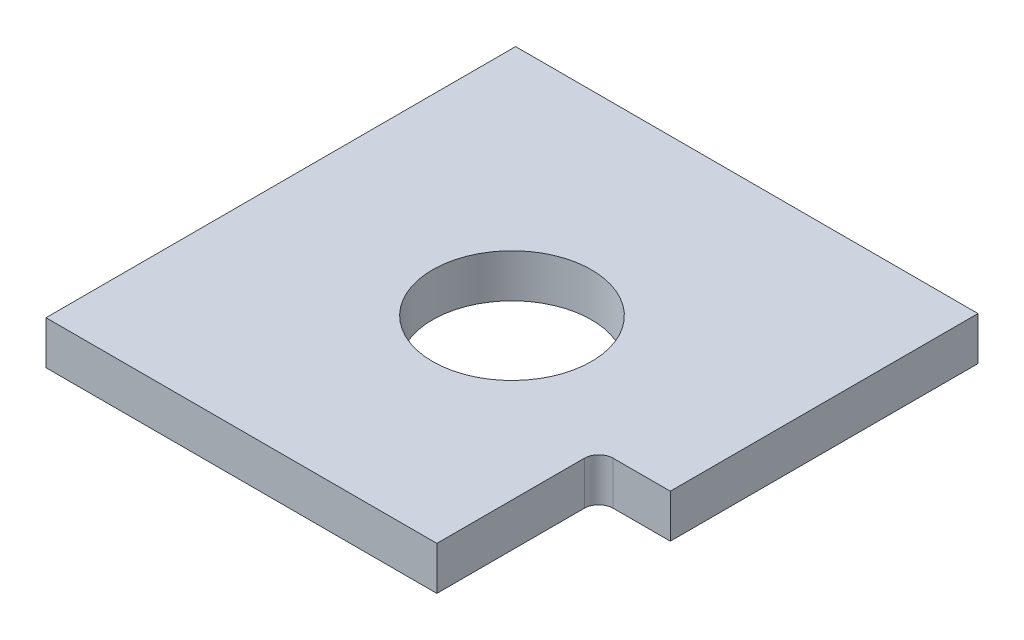
ISO-10303-21;
HEADER;
FILE_DESCRIPTION(('STEP AP214'),'2;1');
FILE_NAME('part.step','',(''),(''),'','','');
FILE_SCHEMA(('AUTOMOTIVE_DESIGN { 1 0 10303 214 1 1 1 1 }'));
ENDSEC;
DATA;
#1=APPLICATION_CONTEXT('core data for automotive mechanical design processes');
#2=APPLICATION_PROTOCOL_DEFINITION('international standard','automotive_design',2000,#1);
#3=PRODUCT_CONTEXT('',#1,'mechanical');
#4=PRODUCT('Part','Part','',(#3));
#5=PRODUCT_RELATED_PRODUCT_CATEGORY('part','',(#4));
#6=PRODUCT_DEFINITION_FORMATION('','',#4);
#7=PRODUCT_DEFINITION_CONTEXT('part definition',#1,'design');
#8=PRODUCT_DEFINITION('design','',#6,#7);
#9=PRODUCT_DEFINITION_SHAPE('','',#8);
#10=(LENGTH_UNIT() NAMED_UNIT(*) SI_UNIT(.MILLI.,.METRE.));
#11=(NAMED_UNIT(*) PLANE_ANGLE_UNIT() SI_UNIT($,.RADIAN.));
#12=(NAMED_UNIT(*) SI_UNIT($,.STERADIAN.) SOLID_ANGLE_UNIT());
#13=UNCERTAINTY_MEASURE_WITH_UNIT(LENGTH_MEASURE(1.E-05),#10,'distance_accuracy_value','');
#14=(GEOMETRIC_REPRESENTATION_CONTEXT(3) GLOBAL_UNCERTAINTY_ASSIGNED_CONTEXT((#13)) GLOBAL_UNIT_ASSIGNED_CONTEXT((#10,
#11,#12)) REPRESENTATION_CONTEXT('',''));
#15=CARTESIAN_POINT('',(0.,0.,0.));
#16=DIRECTION('',(0.,0.,1.));
#17=DIRECTION('',(1.,0.,0.));
#18=AXIS2_PLACEMENT_3D('',#15,#16,#17);
#19=CARTESIAN_POINT('',(24.1000001252952,6.,12.0890702603596));
#20=DIRECTION('',(0.,1.,0.));
#21=DIRECTION('',(0.,0.,1.));
#22=AXIS2_PLACEMENT_3D('',#19,#20,#21);
#23=PLANE('',#22);
#24=DIRECTION('',(0.,0.,-1.));
#25=VECTOR('',#24,1.);
#26=CARTESIAN_POINT('',(22.1000001252951,6.,32.5000000000002));
#27=LINE('',#26,#25);
#28=CARTESIAN_POINT('',(22.1000001252951,6.,32.5000000000002));
#29=VERTEX_POINT('',#28);
#30=CARTESIAN_POINT('',(22.1000001252951,6.,12.0890702603522));
#31=VERTEX_POINT('',#30);
#32=EDGE_CURVE('E145',#29,#31,#27,.T.);
#33=ORIENTED_EDGE('',*,*,#32,.T.);
#34=CARTESIAN_POINT('',(24.1000001252952,6.,12.0890702603596));
#35=DIRECTION('',(0.,-1.,0.));
#36=DIRECTION('',(0.,0.,1.));
#37=AXIS2_PLACEMENT_3D('',#34,#35,#36);
#38=CIRCLE('',#37,2.00000000000013);
#39=CARTESIAN_POINT('',(24.0999996486235,6.,10.0890702603595));
#40=VERTEX_POINT('',#39);
#41=EDGE_CURVE('E98',#31,#40,#38,.T.);
#42=ORIENTED_EDGE('',*,*,#41,.T.);
#43=DIRECTION('',(1.,0.,0.));
#44=VECTOR('',#43,1.);
#45=CARTESIAN_POINT('',(24.0999996486235,6.,10.0890702603595));
#46=LINE('',#45,#44);
#47=CARTESIAN_POINT('',(32.0000001254616,6.,10.0890702603595));
#48=VERTEX_POINT('',#47);
#49=EDGE_CURVE('E157',#40,#48,#46,.T.);
#50=ORIENTED_EDGE('',*,*,#49,.T.);
#51=DIRECTION('',(0.,0.,-1.));
#52=VECTOR('',#51,1.);
#53=CARTESIAN_POINT('',(32.0000001254616,6.,-32.5000000000002));
#54=LINE('',#53,#52);
#55=CARTESIAN_POINT('',(32.0000001254616,6.,-32.5000000000002));
#56=VERTEX_POINT('',#55);
#57=EDGE_CURVE('E114',#48,#56,#54,.T.);
#58=ORIENTED_EDGE('',*,*,#57,.T.);
#59=DIRECTION('',(-1.,0.,0.));
#60=VECTOR('',#59,1.);
#61=CARTESIAN_POINT('',(-31.999999874703,6.,-32.5000000000002));
#62=LINE('',#61,#60);
#63=CARTESIAN_POINT('',(-31.999999874703,6.,-32.5000000000002));
#64=VERTEX_POINT('',#63);
#65=EDGE_CURVE('E108',#56,#64,#62,.T.);
#66=ORIENTED_EDGE('',*,*,#65,.T.);
#67=DIRECTION('',(0.,0.,1.));
#68=VECTOR('',#67,1.);
#69=CARTESIAN_POINT('',(-31.999999874703,6.,32.5000000000002));
#70=LINE('',#69,#68);
#71=CARTESIAN_POINT('',(-31.999999874703,6.,32.5000000000002));
#72=VERTEX_POINT('',#71);
#73=EDGE_CURVE('E112',#64,#72,#70,.T.);
#74=ORIENTED_EDGE('',*,*,#73,.T.);
#75=DIRECTION('',(1.,0.,0.));
#76=VECTOR('',#75,1.);
#77=CARTESIAN_POINT('',(22.1000001252951,6.,32.5000000000002));
#78=LINE('',#77,#76);
#79=EDGE_CURVE('E58',#72,#29,#78,.T.);
#80=ORIENTED_EDGE('',*,*,#79,.T.);
#81=EDGE_LOOP('',(#33,#42,#50,#58,#66,#74,#80));
#82=FACE_BOUND('',#81,.T.);
#83=CARTESIAN_POINT('',(0.,6.,0.));
#84=DIRECTION('',(0.,1.,0.));
#85=DIRECTION('',(0.,0.,1.));
#86=AXIS2_PLACEMENT_3D('',#83,#84,#85);
#87=CIRCLE('',#86,11.);
#88=CARTESIAN_POINT('',(0.,6.,11.));
#89=VERTEX_POINT('',#88);
#90=EDGE_CURVE('E136',#89,#89,#87,.T.);
#91=ORIENTED_EDGE('',*,*,#90,.F.);
#92=EDGE_LOOP('',(#91));
#93=FACE_BOUND('',#92,.T.);
#94=ADVANCED_FACE('F41',(#82,#93),#23,.T.);
#95=CARTESIAN_POINT('',(24.1000001252952,0.,12.0890702603596));
#96=DIRECTION('',(0.,1.,0.));
#97=DIRECTION('',(0.,0.,1.));
#98=AXIS2_PLACEMENT_3D('',#95,#96,#97);
#99=PLANE('',#98);
#100=DIRECTION('',(0.,0.,-1.));
#101=VECTOR('',#100,1.);
#102=CARTESIAN_POINT('',(22.1000001252951,0.,32.5000000000002));
#103=LINE('',#102,#101);
#104=CARTESIAN_POINT('',(22.1000001252951,0.,32.5000000000002));
#105=VERTEX_POINT('',#104);
#106=CARTESIAN_POINT('',(22.1000001252951,0.,12.0890702603522));
#107=VERTEX_POINT('',#106);
#108=EDGE_CURVE('E132',#105,#107,#103,.T.);
#109=ORIENTED_EDGE('',*,*,#108,.F.);
#110=DIRECTION('',(1.,0.,0.));
#111=VECTOR('',#110,1.);
#112=CARTESIAN_POINT('',(22.1000001252951,0.,32.5000000000002));
#113=LINE('',#112,#111);
#114=CARTESIAN_POINT('',(-31.999999874703,0.,32.5000000000002));
#115=VERTEX_POINT('',#114);
#116=EDGE_CURVE('E90',#115,#105,#113,.T.);
#117=ORIENTED_EDGE('',*,*,#116,.F.);
#118=DIRECTION('',(0.,0.,1.));
#119=VECTOR('',#118,1.);
#120=CARTESIAN_POINT('',(-31.999999874703,0.,32.5000000000002));
#121=LINE('',#120,#119);
#122=CARTESIAN_POINT('',(-31.999999874703,0.,-32.5000000000002));
#123=VERTEX_POINT('',#122);
#124=EDGE_CURVE('E84',#123,#115,#121,.T.);
#125=ORIENTED_EDGE('',*,*,#124,.F.);
#126=DIRECTION('',(-1.,0.,0.));
#127=VECTOR('',#126,1.);
#128=CARTESIAN_POINT('',(-31.999999874703,0.,-32.5000000000002));
#129=LINE('',#128,#127);
#130=CARTESIAN_POINT('',(32.0000001254616,0.,-32.5000000000002));
#131=VERTEX_POINT('',#130);
#132=EDGE_CURVE('E122',#131,#123,#129,.T.);
#133=ORIENTED_EDGE('',*,*,#132,.F.);
#134=DIRECTION('',(0.,0.,-1.));
#135=VECTOR('',#134,1.);
#136=CARTESIAN_POINT('',(32.0000001254616,0.,-32.5000000000002));
#137=LINE('',#136,#135);
#138=CARTESIAN_POINT('',(32.0000001254616,0.,10.0890702603595));
#139=VERTEX_POINT('',#138);
#140=EDGE_CURVE('E140',#139,#131,#137,.T.);
#141=ORIENTED_EDGE('',*,*,#140,.F.);
#142=DIRECTION('',(1.,0.,0.));
#143=VECTOR('',#142,1.);
#144=CARTESIAN_POINT('',(24.0999996486235,0.,10.0890702603595));
#145=LINE('',#144,#143);
#146=CARTESIAN_POINT('',(24.0999996486235,0.,10.0890702603595));
#147=VERTEX_POINT('',#146);
#148=EDGE_CURVE('E138',#147,#139,#145,.T.);
#149=ORIENTED_EDGE('',*,*,#148,.F.);
#150=CARTESIAN_POINT('',(24.1000001252952,0.,12.0890702603596));
#151=DIRECTION('',(0.,-1.,0.));
#152=DIRECTION('',(0.,0.,1.));
#153=AXIS2_PLACEMENT_3D('',#150,#151,#152);
#154=CIRCLE('',#153,2.00000000000013);
#155=EDGE_CURVE('E135',#107,#147,#154,.T.);
#156=ORIENTED_EDGE('',*,*,#155,.F.);
#157=EDGE_LOOP('',(#109,#117,#125,#133,#141,#149,#156));
#158=FACE_BOUND('',#157,.T.);
#159=CARTESIAN_POINT('',(0.,0.,0.));
#160=DIRECTION('',(0.,1.,0.));
#161=DIRECTION('',(0.,0.,1.));
#162=AXIS2_PLACEMENT_3D('',#159,#160,#161);
#163=CIRCLE('',#162,11.);
#164=CARTESIAN_POINT('',(0.,0.,11.));
#165=VERTEX_POINT('',#164);
#166=EDGE_CURVE('E169',#165,#165,#163,.T.);
#167=ORIENTED_EDGE('',*,*,#166,.T.);
#168=EDGE_LOOP('',(#167));
#169=FACE_BOUND('',#168,.T.);
#170=ADVANCED_FACE('F161',(#158,#169),#99,.F.);
#171=CARTESIAN_POINT('',(22.1000001252951,6.,32.5000000000002));
#172=DIRECTION('',(-1.,0.,0.));
#173=DIRECTION('',(0.,0.,1.));
#174=AXIS2_PLACEMENT_3D('',#171,#172,#173);
#175=PLANE('',#174);
#176=ORIENTED_EDGE('',*,*,#108,.T.);
#177=DIRECTION('',(0.,-1.,0.));
#178=VECTOR('',#177,1.);
#179=CARTESIAN_POINT('',(22.1000001252951,6.,12.0890702603522));
#180=LINE('',#179,#178);
#181=EDGE_CURVE('E11',#31,#107,#180,.T.);
#182=ORIENTED_EDGE('',*,*,#181,.F.);
#183=ORIENTED_EDGE('',*,*,#32,.F.);
#184=DIRECTION('',(0.,-1.,0.));
#185=VECTOR('',#184,1.);
#186=CARTESIAN_POINT('',(22.1000001252951,6.,32.5000000000002));
#187=LINE('',#186,#185);
#188=EDGE_CURVE('E128',#29,#105,#187,.T.);
#189=ORIENTED_EDGE('',*,*,#188,.T.);
#190=EDGE_LOOP('',(#176,#182,#183,#189));
#191=FACE_BOUND('',#190,.T.);
#192=ADVANCED_FACE('F43',(#191),#175,.F.);
#193=CARTESIAN_POINT('',(24.1000001252952,6.,12.0890702603596));
#194=DIRECTION('',(0.,-1.,0.));
#195=DIRECTION('',(0.,0.,-1.));
#196=AXIS2_PLACEMENT_3D('',#193,#194,#195);
#197=CYLINDRICAL_SURFACE('',#196,2.00000000000013);
#198=ORIENTED_EDGE('',*,*,#155,.T.);
#199=DIRECTION('',(0.,-1.,0.));
#200=VECTOR('',#199,1.);
#201=CARTESIAN_POINT('',(24.0999996486235,6.,10.0890702603595));
#202=LINE('',#201,#200);
#203=EDGE_CURVE('E50',#40,#147,#202,.T.);
#204=ORIENTED_EDGE('',*,*,#203,.F.);
#205=ORIENTED_EDGE('',*,*,#41,.F.);
#206=ORIENTED_EDGE('',*,*,#181,.T.);
#207=EDGE_LOOP('',(#198,#204,#205,#206));
#208=FACE_BOUND('',#207,.T.);
#209=ADVANCED_FACE('F195',(#208),#197,.F.);
#210=CARTESIAN_POINT('',(24.0999996486235,6.,10.0890702603595));
#211=DIRECTION('',(0.,0.,-1.));
#212=DIRECTION('',(-1.,0.,0.));
#213=AXIS2_PLACEMENT_3D('',#210,#211,#212);
#214=PLANE('',#213);
#215=ORIENTED_EDGE('',*,*,#148,.T.);
#216=DIRECTION('',(0.,-1.,0.));
#217=VECTOR('',#216,1.);
#218=CARTESIAN_POINT('',(32.0000001254616,6.,10.0890702603595));
#219=LINE('',#218,#217);
#220=EDGE_CURVE('E149',#48,#139,#219,.T.);
#221=ORIENTED_EDGE('',*,*,#220,.F.);
#222=ORIENTED_EDGE('',*,*,#49,.F.);
#223=ORIENTED_EDGE('',*,*,#203,.T.);
#224=EDGE_LOOP('',(#215,#221,#222,#223));
#225=FACE_BOUND('',#224,.T.);
#226=ADVANCED_FACE('F155',(#225),#214,.F.);
#227=CARTESIAN_POINT('',(32.0000001254616,6.,-32.5000000000002));
#228=DIRECTION('',(-1.,0.,0.));
#229=DIRECTION('',(0.,0.,1.));
#230=AXIS2_PLACEMENT_3D('',#227,#228,#229);
#231=PLANE('',#230);
#232=ORIENTED_EDGE('',*,*,#140,.T.);
#233=DIRECTION('',(0.,-1.,0.));
#234=VECTOR('',#233,1.);
#235=CARTESIAN_POINT('',(32.0000001254616,6.,-32.5000000000002));
#236=LINE('',#235,#234);
#237=EDGE_CURVE('E123',#56,#131,#236,.T.);
#238=ORIENTED_EDGE('',*,*,#237,.F.);
#239=ORIENTED_EDGE('',*,*,#57,.F.);
#240=ORIENTED_EDGE('',*,*,#220,.T.);
#241=EDGE_LOOP('',(#232,#238,#239,#240));
#242=FACE_BOUND('',#241,.T.);
#243=ADVANCED_FACE('F164',(#242),#231,.F.);
#244=CARTESIAN_POINT('',(-31.999999874703,6.,-32.5000000000002));
#245=DIRECTION('',(0.,0.,1.));
#246=DIRECTION('',(1.,0.,0.));
#247=AXIS2_PLACEMENT_3D('',#244,#245,#246);
#248=PLANE('',#247);
#249=ORIENTED_EDGE('',*,*,#132,.T.);
#250=DIRECTION('',(0.,-1.,0.));
#251=VECTOR('',#250,1.);
#252=CARTESIAN_POINT('',(-31.999999874703,6.,-32.5000000000002));
#253=LINE('',#252,#251);
#254=EDGE_CURVE('E119',#64,#123,#253,.T.);
#255=ORIENTED_EDGE('',*,*,#254,.F.);
#256=ORIENTED_EDGE('',*,*,#65,.F.);
#257=ORIENTED_EDGE('',*,*,#237,.T.);
#258=EDGE_LOOP('',(#249,#255,#256,#257));
#259=FACE_BOUND('',#258,.T.);
#260=ADVANCED_FACE('F120',(#259),#248,.F.);
#261=CARTESIAN_POINT('',(-31.999999874703,6.,32.5000000000002));
#262=DIRECTION('',(1.,0.,0.));
#263=DIRECTION('',(0.,0.,-1.));
#264=AXIS2_PLACEMENT_3D('',#261,#262,#263);
#265=PLANE('',#264);
#266=ORIENTED_EDGE('',*,*,#124,.T.);
#267=DIRECTION('',(0.,-1.,0.));
#268=VECTOR('',#267,1.);
#269=CARTESIAN_POINT('',(-31.999999874703,6.,32.5000000000002));
#270=LINE('',#269,#268);
#271=EDGE_CURVE('E124',#72,#115,#270,.T.);
#272=ORIENTED_EDGE('',*,*,#271,.F.);
#273=ORIENTED_EDGE('',*,*,#73,.F.);
#274=ORIENTED_EDGE('',*,*,#254,.T.);
#275=EDGE_LOOP('',(#266,#272,#273,#274));
#276=FACE_BOUND('',#275,.T.);
#277=ADVANCED_FACE('F126',(#276),#265,.F.);
#278=CARTESIAN_POINT('',(22.1000001252951,6.,32.5000000000002));
#279=DIRECTION('',(0.,0.,-1.));
#280=DIRECTION('',(-1.,0.,0.));
#281=AXIS2_PLACEMENT_3D('',#278,#279,#280);
#282=PLANE('',#281);
#283=ORIENTED_EDGE('',*,*,#116,.T.);
#284=ORIENTED_EDGE('',*,*,#188,.F.);
#285=ORIENTED_EDGE('',*,*,#79,.F.);
#286=ORIENTED_EDGE('',*,*,#271,.T.);
#287=EDGE_LOOP('',(#283,#284,#285,#286));
#288=FACE_BOUND('',#287,.T.);
#289=ADVANCED_FACE('F185',(#288),#282,.F.);
#290=CARTESIAN_POINT('',(0.,6.,0.));
#291=DIRECTION('',(0.,-1.,0.));
#292=DIRECTION('',(0.,0.,-1.));
#293=AXIS2_PLACEMENT_3D('',#290,#291,#292);
#294=CYLINDRICAL_SURFACE('',#293,11.);
#295=ORIENTED_EDGE('',*,*,#90,.T.);
#296=EDGE_LOOP('',(#295));
#297=FACE_BOUND('',#296,.T.);
#298=ORIENTED_EDGE('',*,*,#166,.F.);
#299=EDGE_LOOP('',(#298));
#300=FACE_BOUND('',#299,.T.);
#301=ADVANCED_FACE('F175',(#297,#300),#294,.F.);
#302=CLOSED_SHELL('',(#94,#170,#192,#209,#226,#243,#260,#277,#289,#301));
#303=MANIFOLD_SOLID_BREP('B2',#302);
#304=ADVANCED_BREP_SHAPE_REPRESENTATION('',(#18,#303),#14);
#305=SHAPE_DEFINITION_REPRESENTATION(#9,#304);
ENDSEC;
END-ISO-10303-21;
